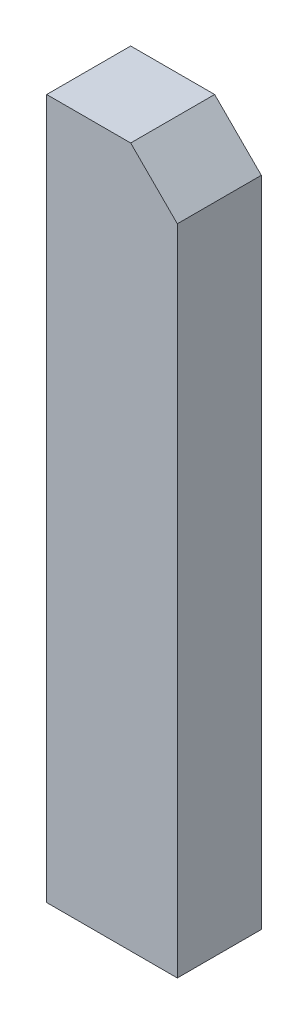
ISO-10303-21;
HEADER;
FILE_DESCRIPTION(('STEP AP214'),'2;1');
FILE_NAME('part.step','',(''),(''),'','','');
FILE_SCHEMA(('AUTOMOTIVE_DESIGN { 1 0 10303 214 1 1 1 1 }'));
ENDSEC;
DATA;
#1=APPLICATION_CONTEXT('core data for automotive mechanical design processes');
#2=APPLICATION_PROTOCOL_DEFINITION('international standard','automotive_design',2000,#1);
#3=PRODUCT_CONTEXT('',#1,'mechanical');
#4=PRODUCT('Part','Part','',(#3));
#5=PRODUCT_RELATED_PRODUCT_CATEGORY('part','',(#4));
#6=PRODUCT_DEFINITION_FORMATION('','',#4);
#7=PRODUCT_DEFINITION_CONTEXT('part definition',#1,'design');
#8=PRODUCT_DEFINITION('design','',#6,#7);
#9=PRODUCT_DEFINITION_SHAPE('','',#8);
#10=(LENGTH_UNIT() NAMED_UNIT(*) SI_UNIT(.MILLI.,.METRE.));
#11=(NAMED_UNIT(*) PLANE_ANGLE_UNIT() SI_UNIT($,.RADIAN.));
#12=(NAMED_UNIT(*) SI_UNIT($,.STERADIAN.) SOLID_ANGLE_UNIT());
#13=UNCERTAINTY_MEASURE_WITH_UNIT(LENGTH_MEASURE(1.E-05),#10,'distance_accuracy_value','');
#14=(GEOMETRIC_REPRESENTATION_CONTEXT(3) GLOBAL_UNCERTAINTY_ASSIGNED_CONTEXT((#13)) GLOBAL_UNIT_ASSIGNED_CONTEXT((#10,
#11,#12)) REPRESENTATION_CONTEXT('',''));
#15=CARTESIAN_POINT('',(0.,0.,0.));
#16=DIRECTION('',(0.,0.,1.));
#17=DIRECTION('',(1.,0.,0.));
#18=AXIS2_PLACEMENT_3D('',#15,#16,#17);
#19=CARTESIAN_POINT('',(1.4,15.,0.899999999999999));
#20=DIRECTION('',(-1.,0.,0.));
#21=DIRECTION('',(0.,0.,1.));
#22=AXIS2_PLACEMENT_3D('',#19,#20,#21);
#23=PLANE('',#22);
#24=DIRECTION('',(0.,-1.,0.));
#25=VECTOR('',#24,1.);
#26=CARTESIAN_POINT('',(1.4,15.,-0.900000000000001));
#27=LINE('',#26,#25);
#28=CARTESIAN_POINT('',(1.4,14.,-0.900000000000001));
#29=VERTEX_POINT('',#28);
#30=CARTESIAN_POINT('',(1.4,0.,-0.900000000000001));
#31=VERTEX_POINT('',#30);
#32=EDGE_CURVE('E104',#29,#31,#27,.T.);
#33=ORIENTED_EDGE('',*,*,#32,.F.);
#34=DIRECTION('',(0.,0.,1.));
#35=VECTOR('',#34,1.);
#36=CARTESIAN_POINT('',(1.4,14.,0.899999999999999));
#37=LINE('',#36,#35);
#38=CARTESIAN_POINT('',(1.4,14.,0.899999999999999));
#39=VERTEX_POINT('',#38);
#40=EDGE_CURVE('E50',#29,#39,#37,.T.);
#41=ORIENTED_EDGE('',*,*,#40,.T.);
#42=DIRECTION('',(0.,-1.,0.));
#43=VECTOR('',#42,1.);
#44=CARTESIAN_POINT('',(1.4,15.,0.899999999999999));
#45=LINE('',#44,#43);
#46=CARTESIAN_POINT('',(1.4,0.,0.899999999999999));
#47=VERTEX_POINT('',#46);
#48=EDGE_CURVE('E112',#39,#47,#45,.T.);
#49=ORIENTED_EDGE('',*,*,#48,.T.);
#50=DIRECTION('',(0.,0.,-1.));
#51=VECTOR('',#50,1.);
#52=CARTESIAN_POINT('',(1.4,0.,0.899999999999999));
#53=LINE('',#52,#51);
#54=EDGE_CURVE('E115',#47,#31,#53,.T.);
#55=ORIENTED_EDGE('',*,*,#54,.T.);
#56=EDGE_LOOP('',(#33,#41,#49,#55));
#57=FACE_BOUND('',#56,.T.);
#58=ADVANCED_FACE('F41',(#57),#23,.F.);
#59=CARTESIAN_POINT('',(-1.4,15.,-0.900000000000001));
#60=DIRECTION('',(0.,0.,1.));
#61=DIRECTION('',(1.,0.,0.));
#62=AXIS2_PLACEMENT_3D('',#59,#60,#61);
#63=PLANE('',#62);
#64=DIRECTION('',(-1.,0.,0.));
#65=VECTOR('',#64,1.);
#66=CARTESIAN_POINT('',(-1.4,15.,-0.900000000000001));
#67=LINE('',#66,#65);
#68=CARTESIAN_POINT('',(0.399999999999998,15.,-0.900000000000001));
#69=VERTEX_POINT('',#68);
#70=CARTESIAN_POINT('',(-1.4,15.,-0.900000000000001));
#71=VERTEX_POINT('',#70);
#72=EDGE_CURVE('E86',#69,#71,#67,.T.);
#73=ORIENTED_EDGE('',*,*,#72,.F.);
#74=DIRECTION('',(-0.707106781186546,0.707106781186549,0.));
#75=VECTOR('',#74,1.);
#76=CARTESIAN_POINT('',(0.399999999999998,15.,-0.900000000000001));
#77=LINE('',#76,#75);
#78=EDGE_CURVE('E64',#69,#29,#77,.F.);
#79=ORIENTED_EDGE('',*,*,#78,.T.);
#80=ORIENTED_EDGE('',*,*,#32,.T.);
#81=DIRECTION('',(-1.,0.,0.));
#82=VECTOR('',#81,1.);
#83=CARTESIAN_POINT('',(-1.4,0.,-0.900000000000001));
#84=LINE('',#83,#82);
#85=CARTESIAN_POINT('',(-1.4,0.,-0.900000000000001));
#86=VERTEX_POINT('',#85);
#87=EDGE_CURVE('E101',#31,#86,#84,.T.);
#88=ORIENTED_EDGE('',*,*,#87,.T.);
#89=DIRECTION('',(0.,-1.,0.));
#90=VECTOR('',#89,1.);
#91=CARTESIAN_POINT('',(-1.4,15.,-0.900000000000001));
#92=LINE('',#91,#90);
#93=EDGE_CURVE('E98',#71,#86,#92,.T.);
#94=ORIENTED_EDGE('',*,*,#93,.F.);
#95=EDGE_LOOP('',(#73,#79,#80,#88,#94));
#96=FACE_BOUND('',#95,.T.);
#97=ADVANCED_FACE('F99',(#96),#63,.F.);
#98=CARTESIAN_POINT('',(-1.4,15.,0.899999999999999));
#99=DIRECTION('',(1.,0.,0.));
#100=DIRECTION('',(0.,0.,-1.));
#101=AXIS2_PLACEMENT_3D('',#98,#99,#100);
#102=PLANE('',#101);
#103=DIRECTION('',(0.,0.,1.));
#104=VECTOR('',#103,1.);
#105=CARTESIAN_POINT('',(-1.4,0.,0.899999999999999));
#106=LINE('',#105,#104);
#107=CARTESIAN_POINT('',(-1.4,0.,0.899999999999999));
#108=VERTEX_POINT('',#107);
#109=EDGE_CURVE('E119',#86,#108,#106,.T.);
#110=ORIENTED_EDGE('',*,*,#109,.T.);
#111=DIRECTION('',(0.,-1.,0.));
#112=VECTOR('',#111,1.);
#113=CARTESIAN_POINT('',(-1.4,15.,0.899999999999999));
#114=LINE('',#113,#112);
#115=CARTESIAN_POINT('',(-1.4,15.,0.899999999999999));
#116=VERTEX_POINT('',#115);
#117=EDGE_CURVE('E105',#116,#108,#114,.T.);
#118=ORIENTED_EDGE('',*,*,#117,.F.);
#119=DIRECTION('',(0.,0.,1.));
#120=VECTOR('',#119,1.);
#121=CARTESIAN_POINT('',(-1.4,15.,0.899999999999999));
#122=LINE('',#121,#120);
#123=EDGE_CURVE('E91',#71,#116,#122,.T.);
#124=ORIENTED_EDGE('',*,*,#123,.F.);
#125=ORIENTED_EDGE('',*,*,#93,.T.);
#126=EDGE_LOOP('',(#110,#118,#124,#125));
#127=FACE_BOUND('',#126,.T.);
#128=ADVANCED_FACE('F107',(#127),#102,.F.);
#129=CARTESIAN_POINT('',(-1.4,15.,0.899999999999999));
#130=DIRECTION('',(0.,0.,-1.));
#131=DIRECTION('',(-1.,0.,0.));
#132=AXIS2_PLACEMENT_3D('',#129,#130,#131);
#133=PLANE('',#132);
#134=ORIENTED_EDGE('',*,*,#48,.F.);
#135=DIRECTION('',(0.707106781186546,-0.707106781186549,0.));
#136=VECTOR('',#135,1.);
#137=CARTESIAN_POINT('',(0.399999999999998,15.,0.899999999999999));
#138=LINE('',#137,#136);
#139=CARTESIAN_POINT('',(0.399999999999998,15.,0.899999999999999));
#140=VERTEX_POINT('',#139);
#141=EDGE_CURVE('E11',#39,#140,#138,.F.);
#142=ORIENTED_EDGE('',*,*,#141,.T.);
#143=DIRECTION('',(1.,0.,0.));
#144=VECTOR('',#143,1.);
#145=CARTESIAN_POINT('',(-1.4,15.,0.899999999999999));
#146=LINE('',#145,#144);
#147=EDGE_CURVE('E110',#116,#140,#146,.T.);
#148=ORIENTED_EDGE('',*,*,#147,.F.);
#149=ORIENTED_EDGE('',*,*,#117,.T.);
#150=DIRECTION('',(1.,0.,0.));
#151=VECTOR('',#150,1.);
#152=CARTESIAN_POINT('',(-1.4,0.,0.899999999999999));
#153=LINE('',#152,#151);
#154=EDGE_CURVE('E95',#108,#47,#153,.T.);
#155=ORIENTED_EDGE('',*,*,#154,.T.);
#156=EDGE_LOOP('',(#134,#142,#148,#149,#155));
#157=FACE_BOUND('',#156,.T.);
#158=ADVANCED_FACE('F133',(#157),#133,.F.);
#159=CARTESIAN_POINT('',(0.,15.,0.));
#160=DIRECTION('',(0.,-1.,0.));
#161=DIRECTION('',(0.,0.,-1.));
#162=AXIS2_PLACEMENT_3D('',#159,#160,#161);
#163=PLANE('',#162);
#164=ORIENTED_EDGE('',*,*,#147,.T.);
#165=DIRECTION('',(0.,0.,-1.));
#166=VECTOR('',#165,1.);
#167=CARTESIAN_POINT('',(0.399999999999998,15.,0.));
#168=LINE('',#167,#166);
#169=EDGE_CURVE('E94',#140,#69,#168,.T.);
#170=ORIENTED_EDGE('',*,*,#169,.T.);
#171=ORIENTED_EDGE('',*,*,#72,.T.);
#172=ORIENTED_EDGE('',*,*,#123,.T.);
#173=EDGE_LOOP('',(#164,#170,#171,#172));
#174=FACE_BOUND('',#173,.T.);
#175=ADVANCED_FACE('F89',(#174),#163,.F.);
#176=CARTESIAN_POINT('',(0.,0.,0.));
#177=DIRECTION('',(0.,-1.,0.));
#178=DIRECTION('',(0.,0.,-1.));
#179=AXIS2_PLACEMENT_3D('',#176,#177,#178);
#180=PLANE('',#179);
#181=ORIENTED_EDGE('',*,*,#54,.F.);
#182=ORIENTED_EDGE('',*,*,#154,.F.);
#183=ORIENTED_EDGE('',*,*,#109,.F.);
#184=ORIENTED_EDGE('',*,*,#87,.F.);
#185=EDGE_LOOP('',(#181,#182,#183,#184));
#186=FACE_BOUND('',#185,.T.);
#187=ADVANCED_FACE('F129',(#186),#180,.T.);
#188=CARTESIAN_POINT('',(0.399999999999998,15.,0.));
#189=DIRECTION('',(-0.707106781186549,-0.707106781186546,0.));
#190=DIRECTION('',(0.,0.,-1.));
#191=AXIS2_PLACEMENT_3D('',#188,#189,#190);
#192=PLANE('',#191);
#193=ORIENTED_EDGE('',*,*,#141,.F.);
#194=ORIENTED_EDGE('',*,*,#40,.F.);
#195=ORIENTED_EDGE('',*,*,#78,.F.);
#196=ORIENTED_EDGE('',*,*,#169,.F.);
#197=EDGE_LOOP('',(#193,#194,#195,#196));
#198=FACE_BOUND('',#197,.T.);
#199=ADVANCED_FACE('F44',(#198),#192,.F.);
#200=CLOSED_SHELL('',(#58,#97,#128,#158,#175,#187,#199));
#201=MANIFOLD_SOLID_BREP('B2',#200);
#202=ADVANCED_BREP_SHAPE_REPRESENTATION('',(#18,#201),#14);
#203=SHAPE_DEFINITION_REPRESENTATION(#9,#202);
ENDSEC;
END-ISO-10303-21;
